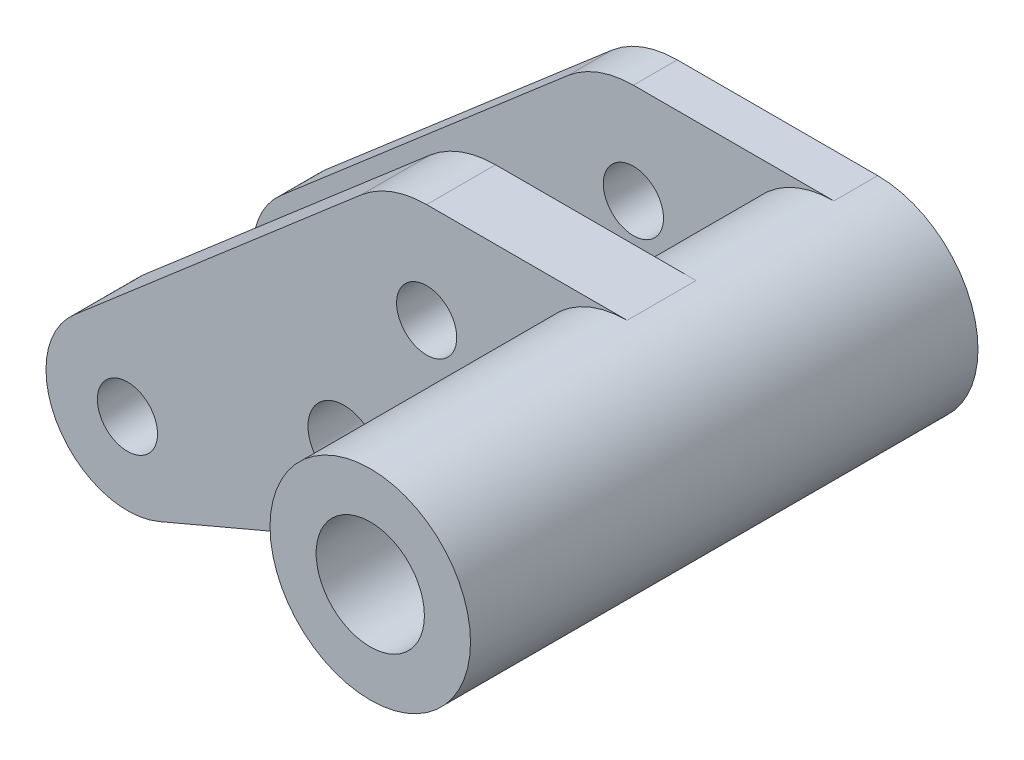
ISO-10303-21;
HEADER;
FILE_DESCRIPTION(('STEP AP214'),'2;1');
FILE_NAME('part.step','',(''),(''),'','','');
FILE_SCHEMA(('AUTOMOTIVE_DESIGN { 1 0 10303 214 1 1 1 1 }'));
ENDSEC;
DATA;
#1=APPLICATION_CONTEXT('core data for automotive mechanical design processes');
#2=APPLICATION_PROTOCOL_DEFINITION('international standard','automotive_design',2000,#1);
#3=PRODUCT_CONTEXT('',#1,'mechanical');
#4=PRODUCT('Part','Part','',(#3));
#5=PRODUCT_RELATED_PRODUCT_CATEGORY('part','',(#4));
#6=PRODUCT_DEFINITION_FORMATION('','',#4);
#7=PRODUCT_DEFINITION_CONTEXT('part definition',#1,'design');
#8=PRODUCT_DEFINITION('design','',#6,#7);
#9=PRODUCT_DEFINITION_SHAPE('','',#8);
#10=(LENGTH_UNIT() NAMED_UNIT(*) SI_UNIT(.MILLI.,.METRE.));
#11=(NAMED_UNIT(*) PLANE_ANGLE_UNIT() SI_UNIT($,.RADIAN.));
#12=(NAMED_UNIT(*) SI_UNIT($,.STERADIAN.) SOLID_ANGLE_UNIT());
#13=UNCERTAINTY_MEASURE_WITH_UNIT(LENGTH_MEASURE(1.E-05),#10,'distance_accuracy_value','');
#14=(GEOMETRIC_REPRESENTATION_CONTEXT(3) GLOBAL_UNCERTAINTY_ASSIGNED_CONTEXT((#13)) GLOBAL_UNIT_ASSIGNED_CONTEXT((#10,
#11,#12)) REPRESENTATION_CONTEXT('',''));
#15=CARTESIAN_POINT('',(0.,0.,0.));
#16=DIRECTION('',(0.,0.,1.));
#17=DIRECTION('',(1.,0.,0.));
#18=AXIS2_PLACEMENT_3D('',#15,#16,#17);
#19=CARTESIAN_POINT('',(-12.7,0.,15.875));
#20=DIRECTION('',(0.,0.,-1.));
#21=DIRECTION('',(1.,0.,0.));
#22=AXIS2_PLACEMENT_3D('',#19,#20,#21);
#23=CYLINDRICAL_SURFACE('',#22,6.35);
#24=DIRECTION('',(0.,0.,-1.));
#25=VECTOR('',#24,1.);
#26=CARTESIAN_POINT('',(-16.8451479640385,4.81043120273306,15.875));
#27=LINE('',#26,#25);
#28=CARTESIAN_POINT('',(-16.8451479640385,4.81043120273306,15.875));
#29=VERTEX_POINT('',#28);
#30=CARTESIAN_POINT('',(-16.8451479640385,4.81043120273306,11.509375));
#31=VERTEX_POINT('',#30);
#32=EDGE_CURVE('E167',#29,#31,#27,.T.);
#33=ORIENTED_EDGE('',*,*,#32,.F.);
#34=CARTESIAN_POINT('',(-12.7,0.,15.875));
#35=DIRECTION('',(0.,0.,1.));
#36=DIRECTION('',(1.,0.,0.));
#37=AXIS2_PLACEMENT_3D('',#34,#35,#36);
#38=CIRCLE('',#37,6.35);
#39=CARTESIAN_POINT('',(-12.7,6.35,15.875));
#40=VERTEX_POINT('',#39);
#41=EDGE_CURVE('E219',#40,#29,#38,.T.);
#42=ORIENTED_EDGE('',*,*,#41,.F.);
#43=DIRECTION('',(0.,0.,-1.));
#44=VECTOR('',#43,1.);
#45=CARTESIAN_POINT('',(-12.7,6.35,15.875));
#46=LINE('',#45,#44);
#47=CARTESIAN_POINT('',(-12.7,6.35,11.509375));
#48=VERTEX_POINT('',#47);
#49=EDGE_CURVE('E57',#40,#48,#46,.T.);
#50=ORIENTED_EDGE('',*,*,#49,.T.);
#51=CARTESIAN_POINT('',(-12.7,0.,11.509375));
#52=DIRECTION('',(0.,0.,1.));
#53=DIRECTION('',(1.,0.,0.));
#54=AXIS2_PLACEMENT_3D('',#51,#52,#53);
#55=CIRCLE('',#54,6.35);
#56=EDGE_CURVE('E363',#48,#31,#55,.T.);
#57=ORIENTED_EDGE('',*,*,#56,.T.);
#58=EDGE_LOOP('',(#33,#42,#50,#57));
#59=FACE_BOUND('',#58,.T.);
#60=ADVANCED_FACE('F47',(#59),#23,.T.);
#61=CARTESIAN_POINT('',(-12.7,6.35,15.875));
#62=DIRECTION('',(0.,1.,0.));
#63=DIRECTION('',(0.,0.,-1.));
#64=AXIS2_PLACEMENT_3D('',#61,#62,#63);
#65=PLANE('',#64);
#66=ORIENTED_EDGE('',*,*,#49,.F.);
#67=DIRECTION('',(-1.,0.,0.));
#68=VECTOR('',#67,1.);
#69=CARTESIAN_POINT('',(-12.7,6.35,15.875));
#70=LINE('',#69,#68);
#71=CARTESIAN_POINT('',(0.,6.35,15.875));
#72=VERTEX_POINT('',#71);
#73=EDGE_CURVE('E79',#72,#40,#70,.T.);
#74=ORIENTED_EDGE('',*,*,#73,.F.);
#75=DIRECTION('',(0.,0.,-1.));
#76=VECTOR('',#75,1.);
#77=CARTESIAN_POINT('',(0.,6.35,15.875));
#78=LINE('',#77,#76);
#79=CARTESIAN_POINT('',(0.,6.35,11.509375));
#80=VERTEX_POINT('',#79);
#81=EDGE_CURVE('E242',#72,#80,#78,.T.);
#82=ORIENTED_EDGE('',*,*,#81,.T.);
#83=DIRECTION('',(-1.,0.,0.));
#84=VECTOR('',#83,1.);
#85=CARTESIAN_POINT('',(0.,6.35,11.509375));
#86=LINE('',#85,#84);
#87=EDGE_CURVE('E366',#80,#48,#86,.T.);
#88=ORIENTED_EDGE('',*,*,#87,.T.);
#89=EDGE_LOOP('',(#66,#74,#82,#88));
#90=FACE_BOUND('',#89,.T.);
#91=ADVANCED_FACE('F470',(#90),#65,.T.);
#92=CARTESIAN_POINT('',(-31.652799462255,-14.759942791294,15.875));
#93=DIRECTION('',(0.,0.,-1.));
#94=DIRECTION('',(1.,0.,0.));
#95=AXIS2_PLACEMENT_3D('',#92,#93,#94);
#96=CYLINDRICAL_SURFACE('',#95,5.159375);
#97=DIRECTION('',(0.,0.,-1.));
#98=VECTOR('',#97,1.);
#99=CARTESIAN_POINT('',(-29.6330292512172,-19.5075399398766,15.875));
#100=LINE('',#99,#98);
#101=CARTESIAN_POINT('',(-29.6330292512172,-19.5075399398766,15.875));
#102=VERTEX_POINT('',#101);
#103=CARTESIAN_POINT('',(-29.6330292512172,-19.5075399398766,11.509375));
#104=VERTEX_POINT('',#103);
#105=EDGE_CURVE('E134',#102,#104,#100,.T.);
#106=ORIENTED_EDGE('',*,*,#105,.F.);
#107=CARTESIAN_POINT('',(-31.652799462255,-14.759942791294,15.875));
#108=DIRECTION('',(0.,0.,1.));
#109=DIRECTION('',(1.,0.,0.));
#110=AXIS2_PLACEMENT_3D('',#107,#108,#109);
#111=CIRCLE('',#110,5.159375);
#112=CARTESIAN_POINT('',(-35.0207321830362,-10.8514674390734,15.875));
#113=VERTEX_POINT('',#112);
#114=EDGE_CURVE('E139',#113,#102,#111,.T.);
#115=ORIENTED_EDGE('',*,*,#114,.F.);
#116=DIRECTION('',(0.,0.,-1.));
#117=VECTOR('',#116,1.);
#118=CARTESIAN_POINT('',(-35.0207321830362,-10.8514674390734,15.875));
#119=LINE('',#118,#117);
#120=CARTESIAN_POINT('',(-35.0207321830362,-10.8514674390734,11.509375));
#121=VERTEX_POINT('',#120);
#122=EDGE_CURVE('E161',#113,#121,#119,.T.);
#123=ORIENTED_EDGE('',*,*,#122,.T.);
#124=CARTESIAN_POINT('',(-31.652799462255,-14.759942791294,11.509375));
#125=DIRECTION('',(0.,0.,1.));
#126=DIRECTION('',(1.,0.,0.));
#127=AXIS2_PLACEMENT_3D('',#124,#125,#126);
#128=CIRCLE('',#127,5.159375);
#129=EDGE_CURVE('E151',#121,#104,#128,.T.);
#130=ORIENTED_EDGE('',*,*,#129,.T.);
#131=EDGE_LOOP('',(#106,#115,#123,#130));
#132=FACE_BOUND('',#131,.T.);
#133=ADVANCED_FACE('F149',(#132),#96,.T.);
#134=CARTESIAN_POINT('',(-35.0207321830362,-10.8514674390734,15.875));
#135=DIRECTION('',(-0.652779206935191,0.757548220902843,0.));
#136=DIRECTION('',(-0.757548220902844,-0.652779206935191,0.));
#137=AXIS2_PLACEMENT_3D('',#134,#135,#136);
#138=PLANE('',#137);
#139=ORIENTED_EDGE('',*,*,#122,.F.);
#140=DIRECTION('',(-0.757548220902844,-0.652779206935191,0.));
#141=VECTOR('',#140,1.);
#142=CARTESIAN_POINT('',(-35.0207321830362,-10.8514674390734,15.875));
#143=LINE('',#142,#141);
#144=EDGE_CURVE('E120',#29,#113,#143,.T.);
#145=ORIENTED_EDGE('',*,*,#144,.F.);
#146=ORIENTED_EDGE('',*,*,#32,.T.);
#147=DIRECTION('',(-0.757548220902844,-0.652779206935191,0.));
#148=VECTOR('',#147,1.);
#149=CARTESIAN_POINT('',(-16.8451479640385,4.81043120273306,11.509375));
#150=LINE('',#149,#148);
#151=EDGE_CURVE('E294',#31,#121,#150,.T.);
#152=ORIENTED_EDGE('',*,*,#151,.T.);
#153=EDGE_LOOP('',(#139,#145,#146,#152));
#154=FACE_BOUND('',#153,.T.);
#155=ADVANCED_FACE('F475',(#154),#138,.T.);
#156=CARTESIAN_POINT('',(-12.7,0.,15.875));
#157=DIRECTION('',(0.,0.,-1.));
#158=DIRECTION('',(1.,0.,0.));
#159=AXIS2_PLACEMENT_3D('',#156,#157,#158);
#160=CYLINDRICAL_SURFACE('',#159,1.905);
#161=CARTESIAN_POINT('',(-12.7,0.,15.875));
#162=DIRECTION('',(0.,0.,1.));
#163=DIRECTION('',(1.,0.,0.));
#164=AXIS2_PLACEMENT_3D('',#161,#162,#163);
#165=CIRCLE('',#164,1.905);
#166=CARTESIAN_POINT('',(-10.795,0.,15.875));
#167=VERTEX_POINT('',#166);
#168=EDGE_CURVE('E212',#167,#167,#165,.T.);
#169=ORIENTED_EDGE('',*,*,#168,.T.);
#170=EDGE_LOOP('',(#169));
#171=FACE_BOUND('',#170,.T.);
#172=CARTESIAN_POINT('',(-12.7,0.,11.509375));
#173=DIRECTION('',(0.,0.,1.));
#174=DIRECTION('',(1.,0.,0.));
#175=AXIS2_PLACEMENT_3D('',#172,#173,#174);
#176=CIRCLE('',#175,1.905);
#177=CARTESIAN_POINT('',(-10.795,0.,11.509375));
#178=VERTEX_POINT('',#177);
#179=EDGE_CURVE('E179',#178,#178,#176,.F.);
#180=ORIENTED_EDGE('',*,*,#179,.T.);
#181=EDGE_LOOP('',(#180));
#182=FACE_BOUND('',#181,.T.);
#183=ADVANCED_FACE('F477',(#171,#182),#160,.F.);
#184=CARTESIAN_POINT('',(-31.652799462255,-14.759942791294,15.875));
#185=DIRECTION('',(0.,0.,-1.));
#186=DIRECTION('',(1.,0.,0.));
#187=AXIS2_PLACEMENT_3D('',#184,#185,#186);
#188=CYLINDRICAL_SURFACE('',#187,1.905);
#189=CARTESIAN_POINT('',(-31.652799462255,-14.759942791294,15.875));
#190=DIRECTION('',(0.,0.,1.));
#191=DIRECTION('',(1.,0.,0.));
#192=AXIS2_PLACEMENT_3D('',#189,#190,#191);
#193=CIRCLE('',#192,1.905);
#194=CARTESIAN_POINT('',(-29.747799462255,-14.759942791294,15.875));
#195=VERTEX_POINT('',#194);
#196=EDGE_CURVE('E204',#195,#195,#193,.T.);
#197=ORIENTED_EDGE('',*,*,#196,.T.);
#198=EDGE_LOOP('',(#197));
#199=FACE_BOUND('',#198,.T.);
#200=CARTESIAN_POINT('',(-31.652799462255,-14.759942791294,11.509375));
#201=DIRECTION('',(0.,0.,1.));
#202=DIRECTION('',(1.,0.,0.));
#203=AXIS2_PLACEMENT_3D('',#200,#201,#202);
#204=CIRCLE('',#203,1.905);
#205=CARTESIAN_POINT('',(-29.747799462255,-14.759942791294,11.509375));
#206=VERTEX_POINT('',#205);
#207=EDGE_CURVE('E176',#206,#206,#204,.F.);
#208=ORIENTED_EDGE('',*,*,#207,.T.);
#209=EDGE_LOOP('',(#208));
#210=FACE_BOUND('',#209,.T.);
#211=ADVANCED_FACE('F482',(#199,#210),#188,.F.);
#212=CARTESIAN_POINT('',(-12.7,0.,2.778125));
#213=DIRECTION('',(0.,0.,1.));
#214=DIRECTION('',(1.,0.,0.));
#215=AXIS2_PLACEMENT_3D('',#212,#213,#214);
#216=CIRCLE('',#215,6.35);
#217=CARTESIAN_POINT('',(-12.7,6.35,2.778125));
#218=VERTEX_POINT('',#217);
#219=CARTESIAN_POINT('',(-16.8451479640385,4.81043120273306,2.778125));
#220=VERTEX_POINT('',#219);
#221=EDGE_CURVE('E345',#218,#220,#216,.T.);
#222=ORIENTED_EDGE('',*,*,#221,.F.);
#223=CARTESIAN_POINT('',(-12.7,6.35,0.));
#224=VERTEX_POINT('',#223);
#225=EDGE_CURVE('E241',#218,#224,#46,.T.);
#226=ORIENTED_EDGE('',*,*,#225,.T.);
#227=CARTESIAN_POINT('',(-12.7,0.,0.));
#228=DIRECTION('',(0.,0.,1.));
#229=DIRECTION('',(1.,0.,0.));
#230=AXIS2_PLACEMENT_3D('',#227,#228,#229);
#231=CIRCLE('',#230,6.35);
#232=CARTESIAN_POINT('',(-16.8451479640385,4.81043120273306,0.));
#233=VERTEX_POINT('',#232);
#234=EDGE_CURVE('E216',#224,#233,#231,.T.);
#235=ORIENTED_EDGE('',*,*,#234,.T.);
#236=EDGE_CURVE('E170',#220,#233,#27,.T.);
#237=ORIENTED_EDGE('',*,*,#236,.F.);
#238=EDGE_LOOP('',(#222,#226,#235,#237));
#239=FACE_BOUND('',#238,.T.);
#240=ADVANCED_FACE('F49',(#239),#23,.T.);
#241=DIRECTION('',(-1.,0.,0.));
#242=VECTOR('',#241,1.);
#243=CARTESIAN_POINT('',(0.,6.35,2.778125));
#244=LINE('',#243,#242);
#245=CARTESIAN_POINT('',(0.,6.35,2.778125));
#246=VERTEX_POINT('',#245);
#247=EDGE_CURVE('E255',#246,#218,#244,.T.);
#248=ORIENTED_EDGE('',*,*,#247,.F.);
#249=CARTESIAN_POINT('',(0.,6.35,0.));
#250=VERTEX_POINT('',#249);
#251=EDGE_CURVE('E157',#246,#250,#78,.T.);
#252=ORIENTED_EDGE('',*,*,#251,.T.);
#253=DIRECTION('',(-1.,0.,0.));
#254=VECTOR('',#253,1.);
#255=CARTESIAN_POINT('',(-12.7,6.35,0.));
#256=LINE('',#255,#254);
#257=EDGE_CURVE('E110',#250,#224,#256,.T.);
#258=ORIENTED_EDGE('',*,*,#257,.T.);
#259=ORIENTED_EDGE('',*,*,#225,.F.);
#260=EDGE_LOOP('',(#248,#252,#258,#259));
#261=FACE_BOUND('',#260,.T.);
#262=ADVANCED_FACE('F252',(#261),#65,.T.);
#263=CARTESIAN_POINT('',(0.,0.,15.875));
#264=DIRECTION('',(0.,0.,-1.));
#265=DIRECTION('',(1.,0.,0.));
#266=AXIS2_PLACEMENT_3D('',#263,#264,#265);
#267=CYLINDRICAL_SURFACE('',#266,6.35);
#268=CARTESIAN_POINT('',(0.,0.,0.));
#269=DIRECTION('',(0.,0.,1.));
#270=DIRECTION('',(1.,0.,0.));
#271=AXIS2_PLACEMENT_3D('',#268,#269,#270);
#272=CIRCLE('',#271,6.35);
#273=CARTESIAN_POINT('',(2.48587102896954,-5.84319649056319,0.));
#274=VERTEX_POINT('',#273);
#275=EDGE_CURVE('E236',#274,#250,#272,.T.);
#276=ORIENTED_EDGE('',*,*,#275,.T.);
#277=ORIENTED_EDGE('',*,*,#251,.F.);
#278=CARTESIAN_POINT('',(0.,0.,2.778125));
#279=DIRECTION('',(0.,0.,-1.));
#280=DIRECTION('',(1.,0.,0.));
#281=AXIS2_PLACEMENT_3D('',#278,#279,#280);
#282=CIRCLE('',#281,6.35);
#283=CARTESIAN_POINT('',(-6.35,0.,2.778125));
#284=VERTEX_POINT('',#283);
#285=EDGE_CURVE('E263',#284,#246,#282,.T.);
#286=ORIENTED_EDGE('',*,*,#285,.F.);
#287=DIRECTION('',(0.,0.,-1.));
#288=VECTOR('',#287,1.);
#289=CARTESIAN_POINT('',(-6.35,0.,11.509375));
#290=LINE('',#289,#288);
#291=CARTESIAN_POINT('',(-6.35,0.,11.509375));
#292=VERTEX_POINT('',#291);
#293=EDGE_CURVE('E175',#292,#284,#290,.T.);
#294=ORIENTED_EDGE('',*,*,#293,.F.);
#295=CARTESIAN_POINT('',(0.,0.,11.509375));
#296=DIRECTION('',(0.,0.,-1.));
#297=DIRECTION('',(1.,0.,0.));
#298=AXIS2_PLACEMENT_3D('',#295,#296,#297);
#299=CIRCLE('',#298,6.35);
#300=EDGE_CURVE('E371',#292,#80,#299,.T.);
#301=ORIENTED_EDGE('',*,*,#300,.T.);
#302=ORIENTED_EDGE('',*,*,#81,.F.);
#303=CARTESIAN_POINT('',(0.,0.,15.875));
#304=DIRECTION('',(0.,0.,-1.));
#305=DIRECTION('',(-1.,0.,0.));
#306=AXIS2_PLACEMENT_3D('',#303,#304,#305);
#307=CIRCLE('',#306,6.35);
#308=CARTESIAN_POINT('',(2.48587102896954,-5.84319649056319,15.875));
#309=VERTEX_POINT('',#308);
#310=EDGE_CURVE('E12',#309,#72,#307,.T.);
#311=ORIENTED_EDGE('',*,*,#310,.F.);
#312=DIRECTION('',(0.,0.,-1.));
#313=VECTOR('',#312,1.);
#314=CARTESIAN_POINT('',(2.48587102896954,-5.84319649056319,15.875));
#315=LINE('',#314,#313);
#316=EDGE_CURVE('E136',#309,#274,#315,.T.);
#317=ORIENTED_EDGE('',*,*,#316,.T.);
#318=EDGE_LOOP('',(#276,#277,#286,#294,#301,#302,#311,#317));
#319=FACE_BOUND('',#318,.T.);
#320=CARTESIAN_POINT('',(0.,0.,32.146875));
#321=DIRECTION('',(0.,0.,1.));
#322=DIRECTION('',(1.,0.,0.));
#323=AXIS2_PLACEMENT_3D('',#320,#321,#322);
#324=CIRCLE('',#323,6.35);
#325=CARTESIAN_POINT('',(6.35,0.,32.146875));
#326=VERTEX_POINT('',#325);
#327=EDGE_CURVE('E386',#326,#326,#324,.T.);
#328=ORIENTED_EDGE('',*,*,#327,.F.);
#329=EDGE_LOOP('',(#328));
#330=FACE_BOUND('',#329,.T.);
#331=ADVANCED_FACE('F258',(#319,#330),#267,.T.);
#332=CARTESIAN_POINT('',(-29.6330292512172,-19.5075399398766,15.875));
#333=DIRECTION('',(0.391475752593628,-0.920188423710738,0.));
#334=DIRECTION('',(0.920188423710738,0.391475752593628,0.));
#335=AXIS2_PLACEMENT_3D('',#332,#333,#334);
#336=PLANE('',#335);
#337=DIRECTION('',(0.920188423710738,0.391475752593628,0.));
#338=VECTOR('',#337,1.);
#339=CARTESIAN_POINT('',(-29.6330292512172,-19.5075399398766,0.));
#340=LINE('',#339,#338);
#341=CARTESIAN_POINT('',(-29.6330292512172,-19.5075399398766,0.));
#342=VERTEX_POINT('',#341);
#343=EDGE_CURVE('E233',#342,#274,#340,.T.);
#344=ORIENTED_EDGE('',*,*,#343,.T.);
#345=ORIENTED_EDGE('',*,*,#316,.F.);
#346=DIRECTION('',(0.920188423710738,0.391475752593628,0.));
#347=VECTOR('',#346,1.);
#348=CARTESIAN_POINT('',(-29.6330292512172,-19.5075399398766,15.875));
#349=LINE('',#348,#347);
#350=EDGE_CURVE('E129',#102,#309,#349,.T.);
#351=ORIENTED_EDGE('',*,*,#350,.F.);
#352=ORIENTED_EDGE('',*,*,#105,.T.);
#353=DIRECTION('',(0.,0.,-1.));
#354=VECTOR('',#353,1.);
#355=CARTESIAN_POINT('',(-29.6330292512172,-19.5075399398766,11.509375));
#356=LINE('',#355,#354);
#357=CARTESIAN_POINT('',(-29.6330292512172,-19.5075399398766,2.778125));
#358=VERTEX_POINT('',#357);
#359=EDGE_CURVE('E186',#104,#358,#356,.T.);
#360=ORIENTED_EDGE('',*,*,#359,.T.);
#361=EDGE_CURVE('E153',#358,#342,#100,.T.);
#362=ORIENTED_EDGE('',*,*,#361,.T.);
#363=EDGE_LOOP('',(#344,#345,#351,#352,#360,#362));
#364=FACE_BOUND('',#363,.T.);
#365=ADVANCED_FACE('F131',(#364),#336,.T.);
#366=CARTESIAN_POINT('',(-31.652799462255,-14.759942791294,2.778125));
#367=DIRECTION('',(0.,0.,1.));
#368=DIRECTION('',(1.,0.,0.));
#369=AXIS2_PLACEMENT_3D('',#366,#367,#368);
#370=CIRCLE('',#369,5.159375);
#371=CARTESIAN_POINT('',(-35.0207321830362,-10.8514674390734,2.778125));
#372=VERTEX_POINT('',#371);
#373=EDGE_CURVE('E349',#372,#358,#370,.T.);
#374=ORIENTED_EDGE('',*,*,#373,.F.);
#375=CARTESIAN_POINT('',(-35.0207321830362,-10.8514674390734,0.));
#376=VERTEX_POINT('',#375);
#377=EDGE_CURVE('E166',#372,#376,#119,.T.);
#378=ORIENTED_EDGE('',*,*,#377,.T.);
#379=CARTESIAN_POINT('',(-31.652799462255,-14.759942791294,0.));
#380=DIRECTION('',(0.,0.,1.));
#381=DIRECTION('',(1.,0.,0.));
#382=AXIS2_PLACEMENT_3D('',#379,#380,#381);
#383=CIRCLE('',#382,5.159375);
#384=EDGE_CURVE('E230',#376,#342,#383,.T.);
#385=ORIENTED_EDGE('',*,*,#384,.T.);
#386=ORIENTED_EDGE('',*,*,#361,.F.);
#387=EDGE_LOOP('',(#374,#378,#385,#386));
#388=FACE_BOUND('',#387,.T.);
#389=ADVANCED_FACE('F448',(#388),#96,.T.);
#390=DIRECTION('',(-0.757548220902844,-0.652779206935191,0.));
#391=VECTOR('',#390,1.);
#392=CARTESIAN_POINT('',(-16.8451479640385,4.81043120273306,2.778125));
#393=LINE('',#392,#391);
#394=EDGE_CURVE('E68',#220,#372,#393,.T.);
#395=ORIENTED_EDGE('',*,*,#394,.F.);
#396=ORIENTED_EDGE('',*,*,#236,.T.);
#397=DIRECTION('',(-0.757548220902844,-0.652779206935191,0.));
#398=VECTOR('',#397,1.);
#399=CARTESIAN_POINT('',(-35.0207321830362,-10.8514674390734,0.));
#400=LINE('',#399,#398);
#401=EDGE_CURVE('E228',#233,#376,#400,.T.);
#402=ORIENTED_EDGE('',*,*,#401,.T.);
#403=ORIENTED_EDGE('',*,*,#377,.F.);
#404=EDGE_LOOP('',(#395,#396,#402,#403));
#405=FACE_BOUND('',#404,.T.);
#406=ADVANCED_FACE('F442',(#405),#138,.T.);
#407=CARTESIAN_POINT('',(-12.7,0.,15.875));
#408=DIRECTION('',(0.,0.,-1.));
#409=DIRECTION('',(1.,0.,0.));
#410=AXIS2_PLACEMENT_3D('',#407,#408,#409);
#411=PLANE('',#410);
#412=CARTESIAN_POINT('',(-17.930468190698,-9.5603718788741,15.875));
#413=DIRECTION('',(0.,0.,-1.));
#414=DIRECTION('',(-1.,0.,0.));
#415=AXIS2_PLACEMENT_3D('',#412,#413,#414);
#416=CIRCLE('',#415,2.286);
#417=CARTESIAN_POINT('',(-20.216468190698,-9.5603718788741,15.875));
#418=VERTEX_POINT('',#417);
#419=EDGE_CURVE('E398',#418,#418,#416,.T.);
#420=ORIENTED_EDGE('',*,*,#419,.T.);
#421=EDGE_LOOP('',(#420));
#422=FACE_BOUND('',#421,.T.);
#423=ORIENTED_EDGE('',*,*,#310,.T.);
#424=ORIENTED_EDGE('',*,*,#73,.T.);
#425=ORIENTED_EDGE('',*,*,#41,.T.);
#426=ORIENTED_EDGE('',*,*,#144,.T.);
#427=ORIENTED_EDGE('',*,*,#114,.T.);
#428=ORIENTED_EDGE('',*,*,#350,.T.);
#429=EDGE_LOOP('',(#423,#424,#425,#426,#427,#428));
#430=FACE_BOUND('',#429,.T.);
#431=ORIENTED_EDGE('',*,*,#196,.F.);
#432=EDGE_LOOP('',(#431));
#433=FACE_BOUND('',#432,.T.);
#434=ORIENTED_EDGE('',*,*,#168,.F.);
#435=EDGE_LOOP('',(#434));
#436=FACE_BOUND('',#435,.T.);
#437=ADVANCED_FACE('F142',(#422,#430,#433,#436),#411,.F.);
#438=CARTESIAN_POINT('',(-12.7,0.,0.));
#439=DIRECTION('',(0.,0.,-1.));
#440=DIRECTION('',(1.,0.,0.));
#441=AXIS2_PLACEMENT_3D('',#438,#439,#440);
#442=PLANE('',#441);
#443=CARTESIAN_POINT('',(-17.930468190698,-9.5603718788741,0.));
#444=DIRECTION('',(0.,0.,-1.));
#445=DIRECTION('',(-1.,0.,0.));
#446=AXIS2_PLACEMENT_3D('',#443,#444,#445);
#447=CIRCLE('',#446,1.905);
#448=CARTESIAN_POINT('',(-19.835468190698,-9.5603718788741,0.));
#449=VERTEX_POINT('',#448);
#450=EDGE_CURVE('E389',#449,#449,#447,.T.);
#451=ORIENTED_EDGE('',*,*,#450,.F.);
#452=EDGE_LOOP('',(#451));
#453=FACE_BOUND('',#452,.T.);
#454=CARTESIAN_POINT('',(0.,0.,0.));
#455=DIRECTION('',(0.,0.,1.));
#456=DIRECTION('',(1.,0.,0.));
#457=AXIS2_PLACEMENT_3D('',#454,#455,#456);
#458=CIRCLE('',#457,3.429);
#459=CARTESIAN_POINT('',(3.429,0.,0.));
#460=VERTEX_POINT('',#459);
#461=EDGE_CURVE('E200',#460,#460,#458,.T.);
#462=ORIENTED_EDGE('',*,*,#461,.T.);
#463=EDGE_LOOP('',(#462));
#464=FACE_BOUND('',#463,.T.);
#465=CARTESIAN_POINT('',(-31.652799462255,-14.759942791294,0.));
#466=DIRECTION('',(0.,0.,1.));
#467=DIRECTION('',(1.,0.,0.));
#468=AXIS2_PLACEMENT_3D('',#465,#466,#467);
#469=CIRCLE('',#468,1.905);
#470=CARTESIAN_POINT('',(-29.747799462255,-14.759942791294,0.));
#471=VERTEX_POINT('',#470);
#472=EDGE_CURVE('E203',#471,#471,#469,.T.);
#473=ORIENTED_EDGE('',*,*,#472,.T.);
#474=EDGE_LOOP('',(#473));
#475=FACE_BOUND('',#474,.T.);
#476=CARTESIAN_POINT('',(-12.7,0.,0.));
#477=DIRECTION('',(0.,0.,1.));
#478=DIRECTION('',(1.,0.,0.));
#479=AXIS2_PLACEMENT_3D('',#476,#477,#478);
#480=CIRCLE('',#479,1.905);
#481=CARTESIAN_POINT('',(-10.795,0.,0.));
#482=VERTEX_POINT('',#481);
#483=EDGE_CURVE('E208',#482,#482,#480,.T.);
#484=ORIENTED_EDGE('',*,*,#483,.T.);
#485=EDGE_LOOP('',(#484));
#486=FACE_BOUND('',#485,.T.);
#487=ORIENTED_EDGE('',*,*,#234,.F.);
#488=ORIENTED_EDGE('',*,*,#257,.F.);
#489=ORIENTED_EDGE('',*,*,#275,.F.);
#490=ORIENTED_EDGE('',*,*,#343,.F.);
#491=ORIENTED_EDGE('',*,*,#384,.F.);
#492=ORIENTED_EDGE('',*,*,#401,.F.);
#493=EDGE_LOOP('',(#487,#488,#489,#490,#491,#492));
#494=FACE_BOUND('',#493,.T.);
#495=ADVANCED_FACE('F424',(#453,#464,#475,#486,#494),#442,.T.);
#496=CARTESIAN_POINT('',(-12.7,0.,2.778125));
#497=DIRECTION('',(0.,0.,1.));
#498=DIRECTION('',(1.,0.,0.));
#499=AXIS2_PLACEMENT_3D('',#496,#497,#498);
#500=CIRCLE('',#499,1.905);
#501=CARTESIAN_POINT('',(-10.795,0.,2.778125));
#502=VERTEX_POINT('',#501);
#503=EDGE_CURVE('E174',#502,#502,#500,.F.);
#504=ORIENTED_EDGE('',*,*,#503,.F.);
#505=EDGE_LOOP('',(#504));
#506=FACE_BOUND('',#505,.T.);
#507=ORIENTED_EDGE('',*,*,#483,.F.);
#508=EDGE_LOOP('',(#507));
#509=FACE_BOUND('',#508,.T.);
#510=ADVANCED_FACE('F427',(#506,#509),#160,.F.);
#511=CARTESIAN_POINT('',(-31.652799462255,-14.759942791294,2.778125));
#512=DIRECTION('',(0.,0.,1.));
#513=DIRECTION('',(1.,0.,0.));
#514=AXIS2_PLACEMENT_3D('',#511,#512,#513);
#515=CIRCLE('',#514,1.905);
#516=CARTESIAN_POINT('',(-29.747799462255,-14.759942791294,2.778125));
#517=VERTEX_POINT('',#516);
#518=EDGE_CURVE('E171',#517,#517,#515,.F.);
#519=ORIENTED_EDGE('',*,*,#518,.F.);
#520=EDGE_LOOP('',(#519));
#521=FACE_BOUND('',#520,.T.);
#522=ORIENTED_EDGE('',*,*,#472,.F.);
#523=EDGE_LOOP('',(#522));
#524=FACE_BOUND('',#523,.T.);
#525=ADVANCED_FACE('F499',(#521,#524),#188,.F.);
#526=CARTESIAN_POINT('',(0.,0.,15.875));
#527=DIRECTION('',(0.,0.,-1.));
#528=DIRECTION('',(1.,0.,0.));
#529=AXIS2_PLACEMENT_3D('',#526,#527,#528);
#530=CYLINDRICAL_SURFACE('',#529,3.429);
#531=ORIENTED_EDGE('',*,*,#461,.F.);
#532=EDGE_LOOP('',(#531));
#533=FACE_BOUND('',#532,.T.);
#534=CARTESIAN_POINT('',(0.,0.,32.146875));
#535=DIRECTION('',(0.,0.,1.));
#536=DIRECTION('',(1.,0.,0.));
#537=AXIS2_PLACEMENT_3D('',#534,#535,#536);
#538=CIRCLE('',#537,3.429);
#539=CARTESIAN_POINT('',(3.429,0.,32.146875));
#540=VERTEX_POINT('',#539);
#541=EDGE_CURVE('E338',#540,#540,#538,.T.);
#542=ORIENTED_EDGE('',*,*,#541,.T.);
#543=EDGE_LOOP('',(#542));
#544=FACE_BOUND('',#543,.T.);
#545=ADVANCED_FACE('F504',(#533,#544),#530,.F.);
#546=CARTESIAN_POINT('',(-31.652799462255,-14.759942791294,11.509375));
#547=DIRECTION('',(0.,0.,-1.));
#548=DIRECTION('',(1.,0.,0.));
#549=AXIS2_PLACEMENT_3D('',#546,#547,#548);
#550=PLANE('',#549);
#551=ORIENTED_EDGE('',*,*,#129,.F.);
#552=ORIENTED_EDGE('',*,*,#151,.F.);
#553=ORIENTED_EDGE('',*,*,#56,.F.);
#554=ORIENTED_EDGE('',*,*,#87,.F.);
#555=ORIENTED_EDGE('',*,*,#300,.F.);
#556=CARTESIAN_POINT('',(-12.7,0.,11.509375));
#557=DIRECTION('',(0.,0.,1.));
#558=DIRECTION('',(1.,0.,0.));
#559=AXIS2_PLACEMENT_3D('',#556,#557,#558);
#560=CIRCLE('',#559,6.35);
#561=CARTESIAN_POINT('',(-15.0739876005431,-5.88954012402222,11.509375));
#562=VERTEX_POINT('',#561);
#563=EDGE_CURVE('E375',#562,#292,#560,.T.);
#564=ORIENTED_EDGE('',*,*,#563,.F.);
#565=DIRECTION('',(0.927486633704287,-0.373856315046155,0.));
#566=VECTOR('',#565,1.);
#567=CARTESIAN_POINT('',(-15.0739876005431,-5.88954012402222,11.509375));
#568=LINE('',#567,#566);
#569=CARTESIAN_POINT('',(-20.2857571130197,-3.78875195738041,11.509375));
#570=VERTEX_POINT('',#569);
#571=EDGE_CURVE('E321',#570,#562,#568,.T.);
#572=ORIENTED_EDGE('',*,*,#571,.F.);
#573=DIRECTION('',(0.453269465346123,0.891373542228419,0.));
#574=VECTOR('',#573,1.);
#575=CARTESIAN_POINT('',(-27.0538690928202,-17.0985299390641,11.509375));
#576=LINE('',#575,#574);
#577=CARTESIAN_POINT('',(-27.0538690928202,-17.0985299390641,11.509375));
#578=VERTEX_POINT('',#577);
#579=EDGE_CURVE('E379',#578,#570,#576,.T.);
#580=ORIENTED_EDGE('',*,*,#579,.F.);
#581=EDGE_CURVE('E352',#104,#578,#128,.T.);
#582=ORIENTED_EDGE('',*,*,#581,.F.);
#583=EDGE_LOOP('',(#551,#552,#553,#554,#555,#564,#572,#580,#582));
#584=FACE_BOUND('',#583,.T.);
#585=ORIENTED_EDGE('',*,*,#207,.F.);
#586=EDGE_LOOP('',(#585));
#587=FACE_BOUND('',#586,.T.);
#588=ORIENTED_EDGE('',*,*,#179,.F.);
#589=EDGE_LOOP('',(#588));
#590=FACE_BOUND('',#589,.T.);
#591=ADVANCED_FACE('F456',(#584,#587,#590),#550,.T.);
#592=CARTESIAN_POINT('',(-31.652799462255,-14.759942791294,2.778125));
#593=DIRECTION('',(0.,0.,-1.));
#594=DIRECTION('',(1.,0.,0.));
#595=AXIS2_PLACEMENT_3D('',#592,#593,#594);
#596=PLANE('',#595);
#597=ORIENTED_EDGE('',*,*,#518,.T.);
#598=EDGE_LOOP('',(#597));
#599=FACE_BOUND('',#598,.T.);
#600=ORIENTED_EDGE('',*,*,#373,.T.);
#601=CARTESIAN_POINT('',(-27.0538690928202,-17.0985299390641,2.778125));
#602=VERTEX_POINT('',#601);
#603=EDGE_CURVE('E286',#358,#602,#370,.T.);
#604=ORIENTED_EDGE('',*,*,#603,.T.);
#605=DIRECTION('',(0.453269465346123,0.891373542228419,0.));
#606=VECTOR('',#605,1.);
#607=CARTESIAN_POINT('',(-27.0538690928202,-17.0985299390641,2.778125));
#608=LINE('',#607,#606);
#609=CARTESIAN_POINT('',(-20.2857571130197,-3.78875195738041,2.778125));
#610=VERTEX_POINT('',#609);
#611=EDGE_CURVE('E334',#602,#610,#608,.T.);
#612=ORIENTED_EDGE('',*,*,#611,.T.);
#613=DIRECTION('',(0.927486633704287,-0.373856315046155,0.));
#614=VECTOR('',#613,1.);
#615=CARTESIAN_POINT('',(-15.0739876005431,-5.88954012402222,2.778125));
#616=LINE('',#615,#614);
#617=CARTESIAN_POINT('',(-15.0739876005431,-5.88954012402222,2.778125));
#618=VERTEX_POINT('',#617);
#619=EDGE_CURVE('E317',#610,#618,#616,.T.);
#620=ORIENTED_EDGE('',*,*,#619,.T.);
#621=CARTESIAN_POINT('',(-12.7,0.,2.778125));
#622=DIRECTION('',(0.,0.,1.));
#623=DIRECTION('',(1.,0.,0.));
#624=AXIS2_PLACEMENT_3D('',#621,#622,#623);
#625=CIRCLE('',#624,6.35);
#626=EDGE_CURVE('E329',#618,#284,#625,.T.);
#627=ORIENTED_EDGE('',*,*,#626,.T.);
#628=ORIENTED_EDGE('',*,*,#285,.T.);
#629=ORIENTED_EDGE('',*,*,#247,.T.);
#630=ORIENTED_EDGE('',*,*,#221,.T.);
#631=ORIENTED_EDGE('',*,*,#394,.T.);
#632=EDGE_LOOP('',(#600,#604,#612,#620,#627,#628,#629,#630,#631));
#633=FACE_BOUND('',#632,.T.);
#634=ORIENTED_EDGE('',*,*,#503,.T.);
#635=EDGE_LOOP('',(#634));
#636=FACE_BOUND('',#635,.T.);
#637=ADVANCED_FACE('F332',(#599,#633,#636),#596,.F.);
#638=CARTESIAN_POINT('',(-31.652799462255,-14.759942791294,11.509375));
#639=DIRECTION('',(0.,0.,-1.));
#640=DIRECTION('',(1.,0.,0.));
#641=AXIS2_PLACEMENT_3D('',#638,#639,#640);
#642=CYLINDRICAL_SURFACE('',#641,5.159375);
#643=ORIENTED_EDGE('',*,*,#359,.F.);
#644=ORIENTED_EDGE('',*,*,#581,.T.);
#645=DIRECTION('',(0.,0.,-1.));
#646=VECTOR('',#645,1.);
#647=CARTESIAN_POINT('',(-27.0538690928202,-17.0985299390641,11.509375));
#648=LINE('',#647,#646);
#649=EDGE_CURVE('E196',#578,#602,#648,.T.);
#650=ORIENTED_EDGE('',*,*,#649,.T.);
#651=ORIENTED_EDGE('',*,*,#603,.F.);
#652=EDGE_LOOP('',(#643,#644,#650,#651));
#653=FACE_BOUND('',#652,.T.);
#654=ADVANCED_FACE('F452',(#653),#642,.F.);
#655=CARTESIAN_POINT('',(-12.7,0.,11.509375));
#656=DIRECTION('',(0.,0.,-1.));
#657=DIRECTION('',(1.,0.,0.));
#658=AXIS2_PLACEMENT_3D('',#655,#656,#657);
#659=CYLINDRICAL_SURFACE('',#658,6.35);
#660=ORIENTED_EDGE('',*,*,#626,.F.);
#661=DIRECTION('',(0.,0.,-1.));
#662=VECTOR('',#661,1.);
#663=CARTESIAN_POINT('',(-15.0739876005431,-5.88954012402222,11.509375));
#664=LINE('',#663,#662);
#665=EDGE_CURVE('E312',#562,#618,#664,.T.);
#666=ORIENTED_EDGE('',*,*,#665,.F.);
#667=ORIENTED_EDGE('',*,*,#563,.T.);
#668=ORIENTED_EDGE('',*,*,#293,.T.);
#669=EDGE_LOOP('',(#660,#666,#667,#668));
#670=FACE_BOUND('',#669,.T.);
#671=ADVANCED_FACE('F330',(#670),#659,.F.);
#672=CARTESIAN_POINT('',(-15.0739876005431,-5.88954012402222,11.509375));
#673=DIRECTION('',(-0.373856315046155,-0.927486633704287,0.));
#674=DIRECTION('',(0.927486633704287,-0.373856315046155,0.));
#675=AXIS2_PLACEMENT_3D('',#672,#673,#674);
#676=PLANE('',#675);
#677=ORIENTED_EDGE('',*,*,#619,.F.);
#678=DIRECTION('',(0.,0.,-1.));
#679=VECTOR('',#678,1.);
#680=CARTESIAN_POINT('',(-20.2857571130197,-3.78875195738041,11.509375));
#681=LINE('',#680,#679);
#682=EDGE_CURVE('E326',#570,#610,#681,.T.);
#683=ORIENTED_EDGE('',*,*,#682,.F.);
#684=ORIENTED_EDGE('',*,*,#571,.T.);
#685=ORIENTED_EDGE('',*,*,#665,.T.);
#686=EDGE_LOOP('',(#677,#683,#684,#685));
#687=FACE_BOUND('',#686,.T.);
#688=ADVANCED_FACE('F314',(#687),#676,.F.);
#689=CARTESIAN_POINT('',(-27.0538690928202,-17.0985299390641,11.509375));
#690=DIRECTION('',(0.89137354222842,-0.453269465346123,0.));
#691=DIRECTION('',(0.453269465346123,0.89137354222842,0.));
#692=AXIS2_PLACEMENT_3D('',#689,#690,#691);
#693=PLANE('',#692);
#694=ORIENTED_EDGE('',*,*,#611,.F.);
#695=ORIENTED_EDGE('',*,*,#649,.F.);
#696=ORIENTED_EDGE('',*,*,#579,.T.);
#697=ORIENTED_EDGE('',*,*,#682,.T.);
#698=EDGE_LOOP('',(#694,#695,#696,#697));
#699=FACE_BOUND('',#698,.T.);
#700=ADVANCED_FACE('F458',(#699),#693,.F.);
#701=CARTESIAN_POINT('',(-12.7,0.,32.146875));
#702=DIRECTION('',(0.,0.,-1.));
#703=DIRECTION('',(1.,0.,0.));
#704=AXIS2_PLACEMENT_3D('',#701,#702,#703);
#705=PLANE('',#704);
#706=ORIENTED_EDGE('',*,*,#541,.F.);
#707=EDGE_LOOP('',(#706));
#708=FACE_BOUND('',#707,.T.);
#709=ORIENTED_EDGE('',*,*,#327,.T.);
#710=EDGE_LOOP('',(#709));
#711=FACE_BOUND('',#710,.T.);
#712=ADVANCED_FACE('F420',(#708,#711),#705,.F.);
#713=CARTESIAN_POINT('',(-17.930468190698,-9.5603718788741,0.));
#714=DIRECTION('',(0.,0.,1.));
#715=DIRECTION('',(-1.,0.,0.));
#716=AXIS2_PLACEMENT_3D('',#713,#714,#715);
#717=CYLINDRICAL_SURFACE('',#716,1.905);
#718=CARTESIAN_POINT('',(-17.930468190698,-9.5603718788741,11.509375));
#719=DIRECTION('',(0.,0.,1.));
#720=DIRECTION('',(1.,0.,0.));
#721=AXIS2_PLACEMENT_3D('',#718,#719,#720);
#722=CIRCLE('',#721,1.905);
#723=CARTESIAN_POINT('',(-16.025468190698,-9.5603718788741,11.509375));
#724=VERTEX_POINT('',#723);
#725=EDGE_CURVE('E51',#724,#724,#722,.F.);
#726=ORIENTED_EDGE('',*,*,#725,.F.);
#727=EDGE_LOOP('',(#726));
#728=FACE_BOUND('',#727,.T.);
#729=ORIENTED_EDGE('',*,*,#450,.T.);
#730=EDGE_LOOP('',(#729));
#731=FACE_BOUND('',#730,.T.);
#732=ADVANCED_FACE('F413',(#728,#731),#717,.F.);
#733=CARTESIAN_POINT('',(-31.652799462255,-14.759942791294,11.509375));
#734=DIRECTION('',(0.,0.,-1.));
#735=DIRECTION('',(1.,0.,0.));
#736=AXIS2_PLACEMENT_3D('',#733,#734,#735);
#737=PLANE('',#736);
#738=CARTESIAN_POINT('',(-17.930468190698,-9.5603718788741,11.509375));
#739=DIRECTION('',(0.,0.,1.));
#740=DIRECTION('',(1.,0.,0.));
#741=AXIS2_PLACEMENT_3D('',#738,#739,#740);
#742=CIRCLE('',#741,2.286);
#743=CARTESIAN_POINT('',(-15.644468190698,-9.5603718788741,11.509375));
#744=VERTEX_POINT('',#743);
#745=EDGE_CURVE('E394',#744,#744,#742,.F.);
#746=ORIENTED_EDGE('',*,*,#745,.F.);
#747=EDGE_LOOP('',(#746));
#748=FACE_BOUND('',#747,.T.);
#749=ORIENTED_EDGE('',*,*,#725,.T.);
#750=EDGE_LOOP('',(#749));
#751=FACE_BOUND('',#750,.T.);
#752=ADVANCED_FACE('F407',(#748,#751),#737,.F.);
#753=CARTESIAN_POINT('',(-17.930468190698,-9.5603718788741,5.04359059283021));
#754=DIRECTION('',(0.,0.,1.));
#755=DIRECTION('',(-1.,0.,0.));
#756=AXIS2_PLACEMENT_3D('',#753,#754,#755);
#757=CYLINDRICAL_SURFACE('',#756,2.286);
#758=ORIENTED_EDGE('',*,*,#419,.F.);
#759=EDGE_LOOP('',(#758));
#760=FACE_BOUND('',#759,.T.);
#761=ORIENTED_EDGE('',*,*,#745,.T.);
#762=EDGE_LOOP('',(#761));
#763=FACE_BOUND('',#762,.T.);
#764=ADVANCED_FACE('F404',(#760,#763),#757,.F.);
#765=CLOSED_SHELL('',(#60,#91,#133,#155,#183,#211,#240,#262,#331,#365,#389,#406,#437,#495,#510,
#525,#545,#591,#637,#654,#671,#688,#700,#712,#732,#752,#764));
#766=MANIFOLD_SOLID_BREP('B2',#765);
#767=ADVANCED_BREP_SHAPE_REPRESENTATION('',(#18,#766),#14);
#768=SHAPE_DEFINITION_REPRESENTATION(#9,#767);
ENDSEC;
END-ISO-10303-21;
